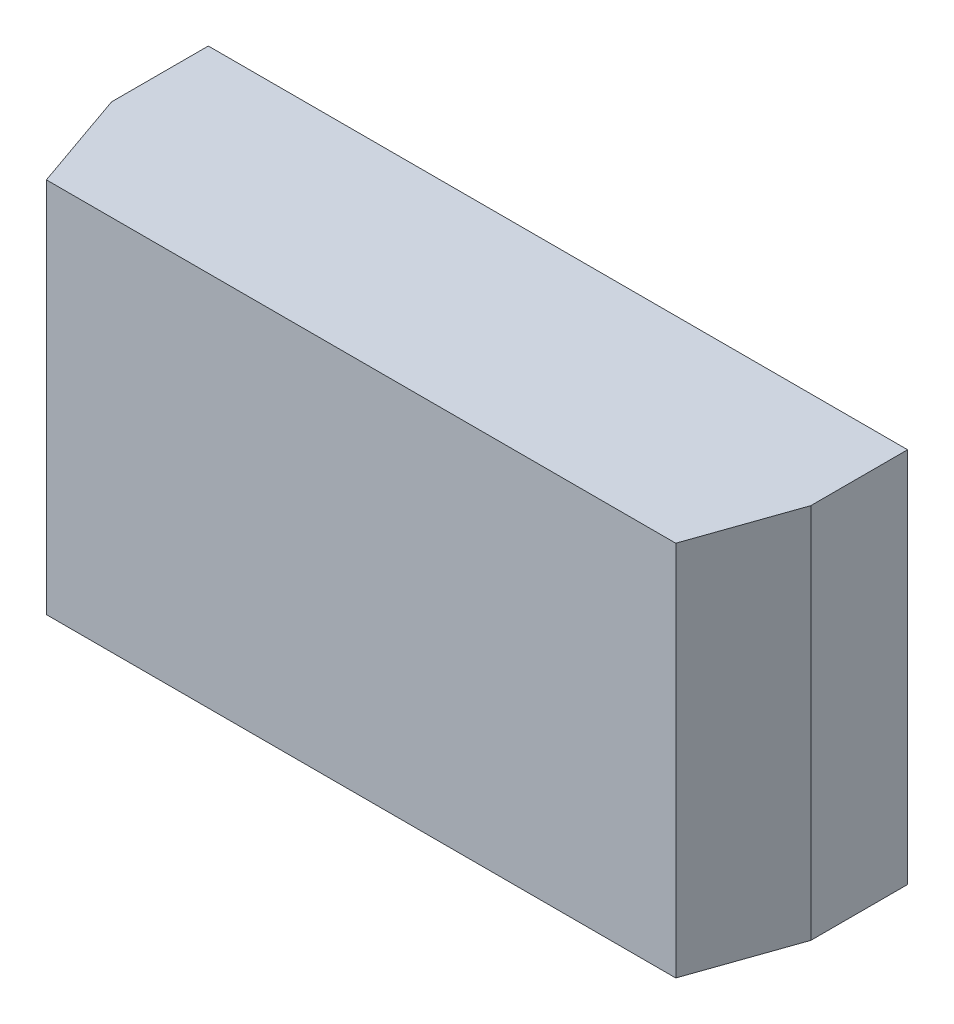
ISO-10303-21;
HEADER;
FILE_DESCRIPTION(('STEP AP214'),'2;1');
FILE_NAME('part.step','',(''),(''),'','','');
FILE_SCHEMA(('AUTOMOTIVE_DESIGN { 1 0 10303 214 1 1 1 1 }'));
ENDSEC;
DATA;
#1=APPLICATION_CONTEXT('core data for automotive mechanical design processes');
#2=APPLICATION_PROTOCOL_DEFINITION('international standard','automotive_design',2000,#1);
#3=PRODUCT_CONTEXT('',#1,'mechanical');
#4=PRODUCT('Part','Part','',(#3));
#5=PRODUCT_RELATED_PRODUCT_CATEGORY('part','',(#4));
#6=PRODUCT_DEFINITION_FORMATION('','',#4);
#7=PRODUCT_DEFINITION_CONTEXT('part definition',#1,'design');
#8=PRODUCT_DEFINITION('design','',#6,#7);
#9=PRODUCT_DEFINITION_SHAPE('','',#8);
#10=(LENGTH_UNIT() NAMED_UNIT(*) SI_UNIT(.MILLI.,.METRE.));
#11=(NAMED_UNIT(*) PLANE_ANGLE_UNIT() SI_UNIT($,.RADIAN.));
#12=(NAMED_UNIT(*) SI_UNIT($,.STERADIAN.) SOLID_ANGLE_UNIT());
#13=UNCERTAINTY_MEASURE_WITH_UNIT(LENGTH_MEASURE(1.E-05),#10,'distance_accuracy_value','');
#14=(GEOMETRIC_REPRESENTATION_CONTEXT(3) GLOBAL_UNCERTAINTY_ASSIGNED_CONTEXT((#13)) GLOBAL_UNIT_ASSIGNED_CONTEXT((#10,
#11,#12)) REPRESENTATION_CONTEXT('',''));
#15=CARTESIAN_POINT('',(0.,0.,0.));
#16=DIRECTION('',(0.,0.,1.));
#17=DIRECTION('',(1.,0.,0.));
#18=AXIS2_PLACEMENT_3D('',#15,#16,#17);
#19=CARTESIAN_POINT('',(0.105,-0.125,0.));
#20=DIRECTION('',(0.,0.,1.));
#21=DIRECTION('',(1.,0.,0.));
#22=AXIS2_PLACEMENT_3D('',#19,#20,#21);
#23=PLANE('',#22);
#24=DIRECTION('',(0.,1.,0.));
#25=VECTOR('',#24,1.);
#26=CARTESIAN_POINT('',(0.275,-0.125,0.));
#27=LINE('',#26,#25);
#28=CARTESIAN_POINT('',(0.275,-0.125,0.));
#29=VERTEX_POINT('',#28);
#30=CARTESIAN_POINT('',(0.275,0.125,0.));
#31=VERTEX_POINT('',#30);
#32=EDGE_CURVE('E134',#29,#31,#27,.T.);
#33=ORIENTED_EDGE('',*,*,#32,.F.);
#34=DIRECTION('',(1.,0.,0.));
#35=VECTOR('',#34,1.);
#36=CARTESIAN_POINT('',(0.105,-0.125,0.));
#37=LINE('',#36,#35);
#38=CARTESIAN_POINT('',(0.105,-0.125,0.));
#39=VERTEX_POINT('',#38);
#40=EDGE_CURVE('E149',#29,#39,#37,.F.);
#41=ORIENTED_EDGE('',*,*,#40,.T.);
#42=DIRECTION('',(0.,1.,0.));
#43=VECTOR('',#42,1.);
#44=CARTESIAN_POINT('',(0.105,-0.125,0.));
#45=LINE('',#44,#43);
#46=CARTESIAN_POINT('',(0.105,0.125,0.));
#47=VERTEX_POINT('',#46);
#48=EDGE_CURVE('E139',#39,#47,#45,.T.);
#49=ORIENTED_EDGE('',*,*,#48,.T.);
#50=DIRECTION('',(1.,0.,0.));
#51=VECTOR('',#50,1.);
#52=CARTESIAN_POINT('',(0.105,0.125,0.));
#53=LINE('',#52,#51);
#54=EDGE_CURVE('E20',#31,#47,#53,.F.);
#55=ORIENTED_EDGE('',*,*,#54,.F.);
#56=EDGE_LOOP('',(#33,#41,#49,#55));
#57=FACE_BOUND('',#56,.T.);
#58=ADVANCED_FACE('F17',(#57),#23,.F.);
#59=CARTESIAN_POINT('',(-0.275,-0.125,0.));
#60=DIRECTION('',(0.,0.,1.));
#61=DIRECTION('',(1.,0.,0.));
#62=AXIS2_PLACEMENT_3D('',#59,#60,#61);
#63=PLANE('',#62);
#64=DIRECTION('',(0.,1.,0.));
#65=VECTOR('',#64,1.);
#66=CARTESIAN_POINT('',(-0.105,-0.125,0.));
#67=LINE('',#66,#65);
#68=CARTESIAN_POINT('',(-0.105,-0.125,0.));
#69=VERTEX_POINT('',#68);
#70=CARTESIAN_POINT('',(-0.105,0.125,0.));
#71=VERTEX_POINT('',#70);
#72=EDGE_CURVE('E167',#69,#71,#67,.T.);
#73=ORIENTED_EDGE('',*,*,#72,.F.);
#74=DIRECTION('',(1.,0.,0.));
#75=VECTOR('',#74,1.);
#76=CARTESIAN_POINT('',(-0.275,-0.125,0.));
#77=LINE('',#76,#75);
#78=CARTESIAN_POINT('',(-0.275,-0.125,0.));
#79=VERTEX_POINT('',#78);
#80=EDGE_CURVE('E173',#69,#79,#77,.F.);
#81=ORIENTED_EDGE('',*,*,#80,.T.);
#82=DIRECTION('',(0.,1.,0.));
#83=VECTOR('',#82,1.);
#84=CARTESIAN_POINT('',(-0.275,-0.125,0.));
#85=LINE('',#84,#83);
#86=CARTESIAN_POINT('',(-0.275,0.125,0.));
#87=VERTEX_POINT('',#86);
#88=EDGE_CURVE('E181',#79,#87,#85,.T.);
#89=ORIENTED_EDGE('',*,*,#88,.T.);
#90=DIRECTION('',(1.,0.,0.));
#91=VECTOR('',#90,1.);
#92=CARTESIAN_POINT('',(-0.275,0.125,0.));
#93=LINE('',#92,#91);
#94=EDGE_CURVE('E164',#71,#87,#93,.F.);
#95=ORIENTED_EDGE('',*,*,#94,.F.);
#96=EDGE_LOOP('',(#73,#81,#89,#95));
#97=FACE_BOUND('',#96,.T.);
#98=ADVANCED_FACE('F513',(#97),#63,.F.);
#99=CARTESIAN_POINT('',(0.02424871130596,0.,0.0085));
#100=DIRECTION('',(0.,0.,-1.));
#101=DIRECTION('',(-1.,0.,0.));
#102=AXIS2_PLACEMENT_3D('',#99,#100,#101);
#103=PLANE('',#102);
#104=DIRECTION('',(0.,1.,0.));
#105=VECTOR('',#104,1.);
#106=CARTESIAN_POINT('',(0.07274613391789,0.084,0.0085));
#107=LINE('',#106,#105);
#108=CARTESIAN_POINT('',(0.07274613391789,-0.084,0.0085));
#109=VERTEX_POINT('',#108);
#110=CARTESIAN_POINT('',(0.0727461339178858,0.0840000000000074,0.0085));
#111=VERTEX_POINT('',#110);
#112=EDGE_CURVE('E185',#109,#111,#107,.T.);
#113=ORIENTED_EDGE('',*,*,#112,.F.);
#114=DIRECTION('',(0.866025403784329,-0.50000000000019,0.));
#115=VECTOR('',#114,1.);
#116=CARTESIAN_POINT('',(0.07274613391789,-0.084,0.0085));
#117=LINE('',#116,#115);
#118=CARTESIAN_POINT('',(-0.0727461339178815,0.,0.0085));
#119=VERTEX_POINT('',#118);
#120=EDGE_CURVE('E190',#119,#109,#117,.T.);
#121=ORIENTED_EDGE('',*,*,#120,.F.);
#122=DIRECTION('',(-0.866025403784329,-0.50000000000019,0.));
#123=VECTOR('',#122,1.);
#124=CARTESIAN_POINT('',(-0.07274613391789,0.,0.0085));
#125=LINE('',#124,#123);
#126=EDGE_CURVE('E199',#111,#119,#125,.T.);
#127=ORIENTED_EDGE('',*,*,#126,.F.);
#128=EDGE_LOOP('',(#113,#121,#127));
#129=FACE_BOUND('',#128,.T.);
#130=ADVANCED_FACE('F505',(#129),#103,.T.);
#131=CARTESIAN_POINT('',(0.105,0.125,0.));
#132=DIRECTION('',(0.,1.,0.));
#133=DIRECTION('',(0.,0.,1.));
#134=AXIS2_PLACEMENT_3D('',#131,#132,#133);
#135=PLANE('',#134);
#136=DIRECTION('',(1.,0.,0.));
#137=VECTOR('',#136,1.);
#138=CARTESIAN_POINT('',(-0.325,0.125,0.017));
#139=LINE('',#138,#137);
#140=CARTESIAN_POINT('',(0.105,0.125,0.017));
#141=VERTEX_POINT('',#140);
#142=CARTESIAN_POINT('',(0.275,0.125,0.017));
#143=VERTEX_POINT('',#142);
#144=EDGE_CURVE('E146',#141,#143,#139,.T.);
#145=ORIENTED_EDGE('',*,*,#144,.T.);
#146=DIRECTION('',(0.,0.,-1.));
#147=VECTOR('',#146,1.);
#148=CARTESIAN_POINT('',(0.275,0.125,0.));
#149=LINE('',#148,#147);
#150=EDGE_CURVE('E143',#31,#143,#149,.F.);
#151=ORIENTED_EDGE('',*,*,#150,.F.);
#152=ORIENTED_EDGE('',*,*,#54,.T.);
#153=DIRECTION('',(0.,0.,-1.));
#154=VECTOR('',#153,1.);
#155=CARTESIAN_POINT('',(0.105,0.125,0.));
#156=LINE('',#155,#154);
#157=EDGE_CURVE('E162',#47,#141,#156,.F.);
#158=ORIENTED_EDGE('',*,*,#157,.T.);
#159=EDGE_LOOP('',(#145,#151,#152,#158));
#160=FACE_BOUND('',#159,.T.);
#161=ADVANCED_FACE('F144',(#160),#135,.T.);
#162=CARTESIAN_POINT('',(0.275,-0.125,0.));
#163=DIRECTION('',(1.,0.,0.));
#164=DIRECTION('',(0.,0.,-1.));
#165=AXIS2_PLACEMENT_3D('',#162,#163,#164);
#166=PLANE('',#165);
#167=ORIENTED_EDGE('',*,*,#150,.T.);
#168=DIRECTION('',(0.,1.,0.));
#169=VECTOR('',#168,1.);
#170=CARTESIAN_POINT('',(0.275,-0.175,0.017));
#171=LINE('',#170,#169);
#172=CARTESIAN_POINT('',(0.275,-0.125,0.017));
#173=VERTEX_POINT('',#172);
#174=EDGE_CURVE('E203',#143,#173,#171,.F.);
#175=ORIENTED_EDGE('',*,*,#174,.T.);
#176=DIRECTION('',(0.,0.,1.));
#177=VECTOR('',#176,1.);
#178=CARTESIAN_POINT('',(0.275,-0.125,0.));
#179=LINE('',#178,#177);
#180=EDGE_CURVE('E153',#173,#29,#179,.F.);
#181=ORIENTED_EDGE('',*,*,#180,.T.);
#182=ORIENTED_EDGE('',*,*,#32,.T.);
#183=EDGE_LOOP('',(#167,#175,#181,#182));
#184=FACE_BOUND('',#183,.T.);
#185=ADVANCED_FACE('F151',(#184),#166,.T.);
#186=CARTESIAN_POINT('',(0.105,-0.125,0.));
#187=DIRECTION('',(0.,1.,0.));
#188=DIRECTION('',(0.,0.,1.));
#189=AXIS2_PLACEMENT_3D('',#186,#187,#188);
#190=PLANE('',#189);
#191=DIRECTION('',(1.,0.,0.));
#192=VECTOR('',#191,1.);
#193=CARTESIAN_POINT('',(-0.325,-0.125,0.017));
#194=LINE('',#193,#192);
#195=CARTESIAN_POINT('',(0.105,-0.125,0.017));
#196=VERTEX_POINT('',#195);
#197=EDGE_CURVE('E205',#173,#196,#194,.F.);
#198=ORIENTED_EDGE('',*,*,#197,.T.);
#199=DIRECTION('',(0.,0.,-1.));
#200=VECTOR('',#199,1.);
#201=CARTESIAN_POINT('',(0.105,-0.125,0.));
#202=LINE('',#201,#200);
#203=EDGE_CURVE('E158',#196,#39,#202,.T.);
#204=ORIENTED_EDGE('',*,*,#203,.T.);
#205=ORIENTED_EDGE('',*,*,#40,.F.);
#206=ORIENTED_EDGE('',*,*,#180,.F.);
#207=EDGE_LOOP('',(#198,#204,#205,#206));
#208=FACE_BOUND('',#207,.T.);
#209=ADVANCED_FACE('F481',(#208),#190,.F.);
#210=CARTESIAN_POINT('',(0.105,-0.125,0.));
#211=DIRECTION('',(1.,0.,0.));
#212=DIRECTION('',(0.,0.,-1.));
#213=AXIS2_PLACEMENT_3D('',#210,#211,#212);
#214=PLANE('',#213);
#215=ORIENTED_EDGE('',*,*,#157,.F.);
#216=ORIENTED_EDGE('',*,*,#48,.F.);
#217=ORIENTED_EDGE('',*,*,#203,.F.);
#218=DIRECTION('',(0.,1.,0.));
#219=VECTOR('',#218,1.);
#220=CARTESIAN_POINT('',(0.105,-0.175,0.017));
#221=LINE('',#220,#219);
#222=EDGE_CURVE('E207',#196,#141,#221,.T.);
#223=ORIENTED_EDGE('',*,*,#222,.T.);
#224=EDGE_LOOP('',(#215,#216,#217,#223));
#225=FACE_BOUND('',#224,.T.);
#226=ADVANCED_FACE('F472',(#225),#214,.F.);
#227=CARTESIAN_POINT('',(-0.275,0.125,0.));
#228=DIRECTION('',(0.,1.,0.));
#229=DIRECTION('',(0.,0.,1.));
#230=AXIS2_PLACEMENT_3D('',#227,#228,#229);
#231=PLANE('',#230);
#232=DIRECTION('',(1.,0.,0.));
#233=VECTOR('',#232,1.);
#234=CARTESIAN_POINT('',(-0.325,0.125,0.017));
#235=LINE('',#234,#233);
#236=CARTESIAN_POINT('',(-0.275,0.125,0.017));
#237=VERTEX_POINT('',#236);
#238=CARTESIAN_POINT('',(-0.105,0.125,0.017));
#239=VERTEX_POINT('',#238);
#240=EDGE_CURVE('E210',#237,#239,#235,.T.);
#241=ORIENTED_EDGE('',*,*,#240,.T.);
#242=DIRECTION('',(0.,0.,-1.));
#243=VECTOR('',#242,1.);
#244=CARTESIAN_POINT('',(-0.105,0.125,0.));
#245=LINE('',#244,#243);
#246=EDGE_CURVE('E170',#71,#239,#245,.F.);
#247=ORIENTED_EDGE('',*,*,#246,.F.);
#248=ORIENTED_EDGE('',*,*,#94,.T.);
#249=DIRECTION('',(0.,0.,-1.));
#250=VECTOR('',#249,1.);
#251=CARTESIAN_POINT('',(-0.275,0.125,0.));
#252=LINE('',#251,#250);
#253=EDGE_CURVE('E183',#87,#237,#252,.F.);
#254=ORIENTED_EDGE('',*,*,#253,.T.);
#255=EDGE_LOOP('',(#241,#247,#248,#254));
#256=FACE_BOUND('',#255,.T.);
#257=ADVANCED_FACE('F463',(#256),#231,.T.);
#258=CARTESIAN_POINT('',(-0.105,-0.125,0.));
#259=DIRECTION('',(1.,0.,0.));
#260=DIRECTION('',(0.,0.,-1.));
#261=AXIS2_PLACEMENT_3D('',#258,#259,#260);
#262=PLANE('',#261);
#263=ORIENTED_EDGE('',*,*,#246,.T.);
#264=DIRECTION('',(0.,1.,0.));
#265=VECTOR('',#264,1.);
#266=CARTESIAN_POINT('',(-0.105,-0.175,0.017));
#267=LINE('',#266,#265);
#268=CARTESIAN_POINT('',(-0.105,-0.125,0.017));
#269=VERTEX_POINT('',#268);
#270=EDGE_CURVE('E212',#239,#269,#267,.F.);
#271=ORIENTED_EDGE('',*,*,#270,.T.);
#272=DIRECTION('',(0.,0.,1.));
#273=VECTOR('',#272,1.);
#274=CARTESIAN_POINT('',(-0.105,-0.125,0.));
#275=LINE('',#274,#273);
#276=EDGE_CURVE('E175',#269,#69,#275,.F.);
#277=ORIENTED_EDGE('',*,*,#276,.T.);
#278=ORIENTED_EDGE('',*,*,#72,.T.);
#279=EDGE_LOOP('',(#263,#271,#277,#278));
#280=FACE_BOUND('',#279,.T.);
#281=ADVANCED_FACE('F454',(#280),#262,.T.);
#282=CARTESIAN_POINT('',(-0.275,-0.125,0.));
#283=DIRECTION('',(0.,1.,0.));
#284=DIRECTION('',(0.,0.,1.));
#285=AXIS2_PLACEMENT_3D('',#282,#283,#284);
#286=PLANE('',#285);
#287=DIRECTION('',(1.,0.,0.));
#288=VECTOR('',#287,1.);
#289=CARTESIAN_POINT('',(-0.325,-0.125,0.017));
#290=LINE('',#289,#288);
#291=CARTESIAN_POINT('',(-0.275,-0.125,0.017));
#292=VERTEX_POINT('',#291);
#293=EDGE_CURVE('E214',#269,#292,#290,.F.);
#294=ORIENTED_EDGE('',*,*,#293,.T.);
#295=DIRECTION('',(0.,0.,-1.));
#296=VECTOR('',#295,1.);
#297=CARTESIAN_POINT('',(-0.275,-0.125,0.));
#298=LINE('',#297,#296);
#299=EDGE_CURVE('E178',#292,#79,#298,.T.);
#300=ORIENTED_EDGE('',*,*,#299,.T.);
#301=ORIENTED_EDGE('',*,*,#80,.F.);
#302=ORIENTED_EDGE('',*,*,#276,.F.);
#303=EDGE_LOOP('',(#294,#300,#301,#302));
#304=FACE_BOUND('',#303,.T.);
#305=ADVANCED_FACE('F445',(#304),#286,.F.);
#306=CARTESIAN_POINT('',(-0.275,-0.125,0.));
#307=DIRECTION('',(1.,0.,0.));
#308=DIRECTION('',(0.,0.,-1.));
#309=AXIS2_PLACEMENT_3D('',#306,#307,#308);
#310=PLANE('',#309);
#311=ORIENTED_EDGE('',*,*,#253,.F.);
#312=ORIENTED_EDGE('',*,*,#88,.F.);
#313=ORIENTED_EDGE('',*,*,#299,.F.);
#314=DIRECTION('',(0.,1.,0.));
#315=VECTOR('',#314,1.);
#316=CARTESIAN_POINT('',(-0.275,-0.175,0.017));
#317=LINE('',#316,#315);
#318=EDGE_CURVE('E216',#292,#237,#317,.T.);
#319=ORIENTED_EDGE('',*,*,#318,.T.);
#320=EDGE_LOOP('',(#311,#312,#313,#319));
#321=FACE_BOUND('',#320,.T.);
#322=ADVANCED_FACE('F434',(#321),#310,.F.);
#323=CARTESIAN_POINT('',(0.07274613391789,0.084,0.0085));
#324=DIRECTION('',(1.,0.,0.));
#325=DIRECTION('',(0.,0.,-1.));
#326=AXIS2_PLACEMENT_3D('',#323,#324,#325);
#327=PLANE('',#326);
#328=DIRECTION('',(0.,0.,1.));
#329=VECTOR('',#328,1.);
#330=CARTESIAN_POINT('',(0.07274613391789,-0.084,0.0085));
#331=LINE('',#330,#329);
#332=CARTESIAN_POINT('',(0.07274613391789,-0.084,0.017));
#333=VERTEX_POINT('',#332);
#334=EDGE_CURVE('E187',#109,#333,#331,.T.);
#335=ORIENTED_EDGE('',*,*,#334,.F.);
#336=ORIENTED_EDGE('',*,*,#112,.T.);
#337=DIRECTION('',(0.,0.,1.));
#338=VECTOR('',#337,1.);
#339=CARTESIAN_POINT('',(0.072746133917873,0.0840000000000295,0.0085));
#340=LINE('',#339,#338);
#341=CARTESIAN_POINT('',(0.0727461339178858,0.0840000000000074,0.017));
#342=VERTEX_POINT('',#341);
#343=EDGE_CURVE('E196',#342,#111,#340,.F.);
#344=ORIENTED_EDGE('',*,*,#343,.F.);
#345=DIRECTION('',(0.,1.,0.));
#346=VECTOR('',#345,1.);
#347=CARTESIAN_POINT('',(0.07274613391789,-0.175,0.017));
#348=LINE('',#347,#346);
#349=EDGE_CURVE('E219',#342,#333,#348,.F.);
#350=ORIENTED_EDGE('',*,*,#349,.T.);
#351=EDGE_LOOP('',(#335,#336,#344,#350));
#352=FACE_BOUND('',#351,.T.);
#353=ADVANCED_FACE('F424',(#352),#327,.T.);
#354=CARTESIAN_POINT('',(0.07274613391789,-0.084,0.0085));
#355=DIRECTION('',(-0.50000000000019,-0.866025403784329,0.));
#356=DIRECTION('',(0.866025403784329,-0.50000000000019,0.));
#357=AXIS2_PLACEMENT_3D('',#354,#355,#356);
#358=PLANE('',#357);
#359=DIRECTION('',(0.,0.,1.));
#360=VECTOR('',#359,1.);
#361=CARTESIAN_POINT('',(-0.07274613391789,0.,0.0085));
#362=LINE('',#361,#360);
#363=CARTESIAN_POINT('',(-0.0727461339178815,0.,0.017));
#364=VERTEX_POINT('',#363);
#365=EDGE_CURVE('E193',#119,#364,#362,.T.);
#366=ORIENTED_EDGE('',*,*,#365,.F.);
#367=ORIENTED_EDGE('',*,*,#120,.T.);
#368=ORIENTED_EDGE('',*,*,#334,.T.);
#369=DIRECTION('',(-0.86602540378443,0.500000000000015,0.));
#370=VECTOR('',#369,1.);
#371=CARTESIAN_POINT('',(0.07274613391789,-0.084,0.017));
#372=LINE('',#371,#370);
#373=EDGE_CURVE('E221',#333,#364,#372,.T.);
#374=ORIENTED_EDGE('',*,*,#373,.T.);
#375=EDGE_LOOP('',(#366,#367,#368,#374));
#376=FACE_BOUND('',#375,.T.);
#377=ADVANCED_FACE('F301',(#376),#358,.T.);
#378=CARTESIAN_POINT('',(-0.07274613391789,0.,0.0085));
#379=DIRECTION('',(-0.50000000000019,0.866025403784329,0.));
#380=DIRECTION('',(-0.866025403784329,-0.50000000000019,0.));
#381=AXIS2_PLACEMENT_3D('',#378,#379,#380);
#382=PLANE('',#381);
#383=ORIENTED_EDGE('',*,*,#343,.T.);
#384=ORIENTED_EDGE('',*,*,#126,.T.);
#385=ORIENTED_EDGE('',*,*,#365,.T.);
#386=DIRECTION('',(0.86602540378443,0.500000000000015,0.));
#387=VECTOR('',#386,1.);
#388=CARTESIAN_POINT('',(-0.07274613391789,0.,0.017));
#389=LINE('',#388,#387);
#390=EDGE_CURVE('E223',#364,#342,#389,.T.);
#391=ORIENTED_EDGE('',*,*,#390,.T.);
#392=EDGE_LOOP('',(#383,#384,#385,#391));
#393=FACE_BOUND('',#392,.T.);
#394=ADVANCED_FACE('F292',(#393),#382,.T.);
#395=CARTESIAN_POINT('',(-0.325,-0.175,0.017));
#396=DIRECTION('',(0.,0.,1.));
#397=DIRECTION('',(1.,0.,0.));
#398=AXIS2_PLACEMENT_3D('',#395,#396,#397);
#399=PLANE('',#398);
#400=ORIENTED_EDGE('',*,*,#373,.F.);
#401=ORIENTED_EDGE('',*,*,#349,.F.);
#402=ORIENTED_EDGE('',*,*,#390,.F.);
#403=EDGE_LOOP('',(#400,#401,#402));
#404=FACE_BOUND('',#403,.T.);
#405=ORIENTED_EDGE('',*,*,#293,.F.);
#406=ORIENTED_EDGE('',*,*,#270,.F.);
#407=ORIENTED_EDGE('',*,*,#240,.F.);
#408=ORIENTED_EDGE('',*,*,#318,.F.);
#409=EDGE_LOOP('',(#405,#406,#407,#408));
#410=FACE_BOUND('',#409,.T.);
#411=ORIENTED_EDGE('',*,*,#197,.F.);
#412=ORIENTED_EDGE('',*,*,#174,.F.);
#413=ORIENTED_EDGE('',*,*,#144,.F.);
#414=ORIENTED_EDGE('',*,*,#222,.F.);
#415=EDGE_LOOP('',(#411,#412,#413,#414));
#416=FACE_BOUND('',#415,.T.);
#417=DIRECTION('',(0.,1.,0.));
#418=VECTOR('',#417,1.);
#419=CARTESIAN_POINT('',(0.325,-0.175,0.017));
#420=LINE('',#419,#418);
#421=CARTESIAN_POINT('',(0.325,-0.175,0.017));
#422=VERTEX_POINT('',#421);
#423=CARTESIAN_POINT('',(0.325,0.175,0.017));
#424=VERTEX_POINT('',#423);
#425=EDGE_CURVE('E235',#422,#424,#420,.T.);
#426=ORIENTED_EDGE('',*,*,#425,.F.);
#427=DIRECTION('',(1.,0.,0.));
#428=VECTOR('',#427,1.);
#429=CARTESIAN_POINT('',(-0.325,-0.175,0.017));
#430=LINE('',#429,#428);
#431=CARTESIAN_POINT('',(-0.325,-0.175,0.017));
#432=VERTEX_POINT('',#431);
#433=EDGE_CURVE('E228',#422,#432,#430,.F.);
#434=ORIENTED_EDGE('',*,*,#433,.T.);
#435=DIRECTION('',(0.,1.,0.));
#436=VECTOR('',#435,1.);
#437=CARTESIAN_POINT('',(-0.325,-0.175,0.017));
#438=LINE('',#437,#436);
#439=CARTESIAN_POINT('',(-0.325,0.175,0.017));
#440=VERTEX_POINT('',#439);
#441=EDGE_CURVE('E226',#432,#440,#438,.T.);
#442=ORIENTED_EDGE('',*,*,#441,.T.);
#443=DIRECTION('',(1.,0.,0.));
#444=VECTOR('',#443,1.);
#445=CARTESIAN_POINT('',(-0.325,0.175,0.017));
#446=LINE('',#445,#444);
#447=EDGE_CURVE('E238',#424,#440,#446,.F.);
#448=ORIENTED_EDGE('',*,*,#447,.F.);
#449=EDGE_LOOP('',(#426,#434,#442,#448));
#450=FACE_BOUND('',#449,.T.);
#451=ADVANCED_FACE('F290',(#404,#410,#416,#450),#399,.F.);
#452=CARTESIAN_POINT('',(-0.325,-0.175,0.017));
#453=DIRECTION('',(1.,0.,0.));
#454=DIRECTION('',(0.,0.,-1.));
#455=AXIS2_PLACEMENT_3D('',#452,#453,#454);
#456=PLANE('',#455);
#457=DIRECTION('',(0.,0.,1.));
#458=VECTOR('',#457,1.);
#459=CARTESIAN_POINT('',(-0.325,0.175,0.017));
#460=LINE('',#459,#458);
#461=CARTESIAN_POINT('',(-0.325,0.175,0.107));
#462=VERTEX_POINT('',#461);
#463=EDGE_CURVE('E241',#440,#462,#460,.T.);
#464=ORIENTED_EDGE('',*,*,#463,.F.);
#465=ORIENTED_EDGE('',*,*,#441,.F.);
#466=DIRECTION('',(0.,0.,1.));
#467=VECTOR('',#466,1.);
#468=CARTESIAN_POINT('',(-0.325,-0.175,0.017));
#469=LINE('',#468,#467);
#470=CARTESIAN_POINT('',(-0.325,-0.175,0.107));
#471=VERTEX_POINT('',#470);
#472=EDGE_CURVE('E230',#432,#471,#469,.T.);
#473=ORIENTED_EDGE('',*,*,#472,.T.);
#474=DIRECTION('',(0.,1.,0.));
#475=VECTOR('',#474,1.);
#476=CARTESIAN_POINT('',(-0.325,0.175,0.107));
#477=LINE('',#476,#475);
#478=EDGE_CURVE('E247',#462,#471,#477,.F.);
#479=ORIENTED_EDGE('',*,*,#478,.F.);
#480=EDGE_LOOP('',(#464,#465,#473,#479));
#481=FACE_BOUND('',#480,.T.);
#482=ADVANCED_FACE('F288',(#481),#456,.F.);
#483=CARTESIAN_POINT('',(0.325,-0.175,0.017));
#484=DIRECTION('',(1.,0.,0.));
#485=DIRECTION('',(0.,0.,-1.));
#486=AXIS2_PLACEMENT_3D('',#483,#484,#485);
#487=PLANE('',#486);
#488=DIRECTION('',(0.,0.,1.));
#489=VECTOR('',#488,1.);
#490=CARTESIAN_POINT('',(0.325,0.175,0.017));
#491=LINE('',#490,#489);
#492=CARTESIAN_POINT('',(0.325000000000009,0.175,0.107000000000003));
#493=VERTEX_POINT('',#492);
#494=EDGE_CURVE('E244',#493,#424,#491,.F.);
#495=ORIENTED_EDGE('',*,*,#494,.F.);
#496=DIRECTION('',(0.,1.,0.));
#497=VECTOR('',#496,1.);
#498=CARTESIAN_POINT('',(0.325000000000035,0.175,0.107000000000012));
#499=LINE('',#498,#497);
#500=CARTESIAN_POINT('',(0.325000000000004,-0.175,0.107000000000002));
#501=VERTEX_POINT('',#500);
#502=EDGE_CURVE('E255',#501,#493,#499,.T.);
#503=ORIENTED_EDGE('',*,*,#502,.F.);
#504=DIRECTION('',(0.,0.,-1.));
#505=VECTOR('',#504,1.);
#506=CARTESIAN_POINT('',(0.325,-0.175,0.017));
#507=LINE('',#506,#505);
#508=EDGE_CURVE('E232',#501,#422,#507,.T.);
#509=ORIENTED_EDGE('',*,*,#508,.T.);
#510=ORIENTED_EDGE('',*,*,#425,.T.);
#511=EDGE_LOOP('',(#495,#503,#509,#510));
#512=FACE_BOUND('',#511,.T.);
#513=ADVANCED_FACE('F279',(#512),#487,.T.);
#514=CARTESIAN_POINT('',(-0.325,0.175,0.107));
#515=DIRECTION('',(-0.944016499749367,0.,0.329898239160128));
#516=DIRECTION('',(0.329898239160128,0.,0.944016499749367));
#517=AXIS2_PLACEMENT_3D('',#514,#515,#516);
#518=PLANE('',#517);
#519=DIRECTION('',(0.,1.,0.));
#520=VECTOR('',#519,1.);
#521=CARTESIAN_POINT('',(-0.2925,0.175,0.2));
#522=LINE('',#521,#520);
#523=CARTESIAN_POINT('',(-0.292499999999982,0.175,0.199999999999994));
#524=VERTEX_POINT('',#523);
#525=CARTESIAN_POINT('',(-0.292499999999982,-0.175,0.199999999999994));
#526=VERTEX_POINT('',#525);
#527=EDGE_CURVE('E261',#524,#526,#522,.F.);
#528=ORIENTED_EDGE('',*,*,#527,.F.);
#529=DIRECTION('',(0.329898239159769,0.,0.944016499749493));
#530=VECTOR('',#529,1.);
#531=CARTESIAN_POINT('',(-0.325,0.175,0.107));
#532=LINE('',#531,#530);
#533=EDGE_CURVE('E257',#462,#524,#532,.T.);
#534=ORIENTED_EDGE('',*,*,#533,.F.);
#535=ORIENTED_EDGE('',*,*,#478,.T.);
#536=DIRECTION('',(0.329898239159769,0.,0.944016499749493));
#537=VECTOR('',#536,1.);
#538=CARTESIAN_POINT('',(-0.325,-0.175,0.107));
#539=LINE('',#538,#537);
#540=EDGE_CURVE('E250',#471,#526,#539,.T.);
#541=ORIENTED_EDGE('',*,*,#540,.T.);
#542=EDGE_LOOP('',(#528,#534,#535,#541));
#543=FACE_BOUND('',#542,.T.);
#544=ADVANCED_FACE('F285',(#543),#518,.T.);
#545=CARTESIAN_POINT('',(0.,-0.175,0.15138936053));
#546=DIRECTION('',(0.,1.,0.));
#547=DIRECTION('',(0.,0.,1.));
#548=AXIS2_PLACEMENT_3D('',#545,#546,#547);
#549=PLANE('',#548);
#550=DIRECTION('',(0.329898239160128,0.,-0.944016499749367));
#551=VECTOR('',#550,1.);
#552=CARTESIAN_POINT('',(0.2925,-0.175,0.2));
#553=LINE('',#552,#551);
#554=CARTESIAN_POINT('',(0.2925,-0.175,0.2));
#555=VERTEX_POINT('',#554);
#556=EDGE_CURVE('E252',#555,#501,#553,.T.);
#557=ORIENTED_EDGE('',*,*,#556,.F.);
#558=DIRECTION('',(1.,0.,0.));
#559=VECTOR('',#558,1.);
#560=CARTESIAN_POINT('',(-0.2925,-0.175,0.2));
#561=LINE('',#560,#559);
#562=EDGE_CURVE('E264',#526,#555,#561,.T.);
#563=ORIENTED_EDGE('',*,*,#562,.F.);
#564=ORIENTED_EDGE('',*,*,#540,.F.);
#565=ORIENTED_EDGE('',*,*,#472,.F.);
#566=ORIENTED_EDGE('',*,*,#433,.F.);
#567=ORIENTED_EDGE('',*,*,#508,.F.);
#568=EDGE_LOOP('',(#557,#563,#564,#565,#566,#567));
#569=FACE_BOUND('',#568,.T.);
#570=ADVANCED_FACE('F274',(#569),#549,.F.);
#571=CARTESIAN_POINT('',(0.2925,0.175,0.2));
#572=DIRECTION('',(0.944016499749367,0.,0.329898239160128));
#573=DIRECTION('',(0.329898239160128,0.,-0.944016499749367));
#574=AXIS2_PLACEMENT_3D('',#571,#572,#573);
#575=PLANE('',#574);
#576=ORIENTED_EDGE('',*,*,#502,.T.);
#577=DIRECTION('',(0.329898239159769,0.,-0.944016499749493));
#578=VECTOR('',#577,1.);
#579=CARTESIAN_POINT('',(0.2925,0.175,0.2));
#580=LINE('',#579,#578);
#581=CARTESIAN_POINT('',(0.2925,0.175,0.2));
#582=VERTEX_POINT('',#581);
#583=EDGE_CURVE('E35',#582,#493,#580,.T.);
#584=ORIENTED_EDGE('',*,*,#583,.F.);
#585=DIRECTION('',(0.,1.,0.));
#586=VECTOR('',#585,1.);
#587=CARTESIAN_POINT('',(0.2925,0.175,0.2));
#588=LINE('',#587,#586);
#589=EDGE_CURVE('E26',#555,#582,#588,.T.);
#590=ORIENTED_EDGE('',*,*,#589,.F.);
#591=ORIENTED_EDGE('',*,*,#556,.T.);
#592=EDGE_LOOP('',(#576,#584,#590,#591));
#593=FACE_BOUND('',#592,.T.);
#594=ADVANCED_FACE('F271',(#593),#575,.T.);
#595=CARTESIAN_POINT('',(0.,0.175,0.15138936053));
#596=DIRECTION('',(0.,1.,0.));
#597=DIRECTION('',(0.,0.,1.));
#598=AXIS2_PLACEMENT_3D('',#595,#596,#597);
#599=PLANE('',#598);
#600=ORIENTED_EDGE('',*,*,#583,.T.);
#601=ORIENTED_EDGE('',*,*,#494,.T.);
#602=ORIENTED_EDGE('',*,*,#447,.T.);
#603=ORIENTED_EDGE('',*,*,#463,.T.);
#604=ORIENTED_EDGE('',*,*,#533,.T.);
#605=DIRECTION('',(1.,0.,0.));
#606=VECTOR('',#605,1.);
#607=CARTESIAN_POINT('',(-0.2925,0.175,0.2));
#608=LINE('',#607,#606);
#609=EDGE_CURVE('E11',#582,#524,#608,.F.);
#610=ORIENTED_EDGE('',*,*,#609,.F.);
#611=EDGE_LOOP('',(#600,#601,#602,#603,#604,#610));
#612=FACE_BOUND('',#611,.T.);
#613=ADVANCED_FACE('F281',(#612),#599,.T.);
#614=CARTESIAN_POINT('',(-0.2925,0.175,0.2));
#615=DIRECTION('',(0.,0.,1.));
#616=DIRECTION('',(1.,0.,0.));
#617=AXIS2_PLACEMENT_3D('',#614,#615,#616);
#618=PLANE('',#617);
#619=ORIENTED_EDGE('',*,*,#589,.T.);
#620=ORIENTED_EDGE('',*,*,#609,.T.);
#621=ORIENTED_EDGE('',*,*,#527,.T.);
#622=ORIENTED_EDGE('',*,*,#562,.T.);
#623=EDGE_LOOP('',(#619,#620,#621,#622));
#624=FACE_BOUND('',#623,.T.);
#625=ADVANCED_FACE('F269',(#624),#618,.T.);
#626=CLOSED_SHELL('',(#58,#98,#130,#161,#185,#209,#226,#257,#281,#305,#322,#353,#377,#394,#451,
#482,#513,#544,#570,#594,#613,#625));
#627=MANIFOLD_SOLID_BREP('B1',#626);
#628=ADVANCED_BREP_SHAPE_REPRESENTATION('',(#18,#627),#14);
#629=SHAPE_DEFINITION_REPRESENTATION(#9,#628);
ENDSEC;
END-ISO-10303-21;
